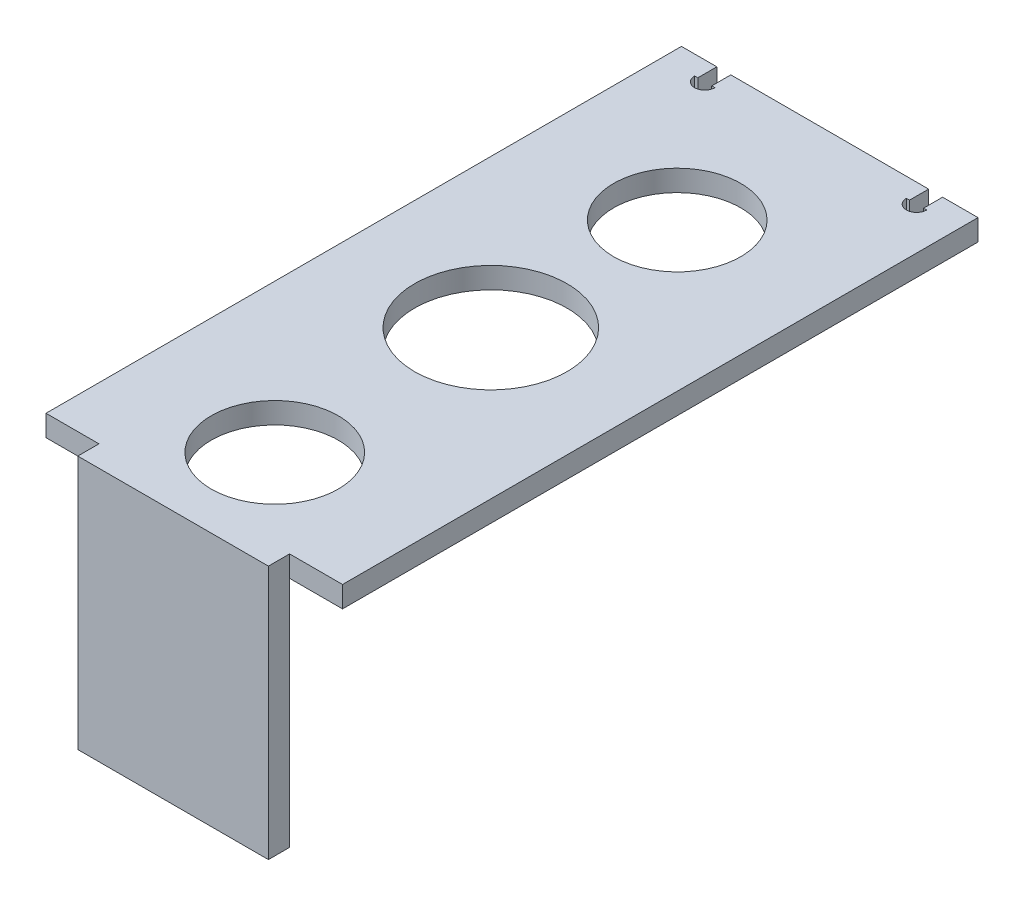
ISO-10303-21;
HEADER;
FILE_DESCRIPTION(('STEP AP214'),'2;1');
FILE_NAME('part.step','',(''),(''),'','','');
FILE_SCHEMA(('AUTOMOTIVE_DESIGN { 1 0 10303 214 1 1 1 1 }'));
ENDSEC;
DATA;
#1=APPLICATION_CONTEXT('core data for automotive mechanical design processes');
#2=APPLICATION_PROTOCOL_DEFINITION('international standard','automotive_design',2000,#1);
#3=PRODUCT_CONTEXT('',#1,'mechanical');
#4=PRODUCT('Part','Part','',(#3));
#5=PRODUCT_RELATED_PRODUCT_CATEGORY('part','',(#4));
#6=PRODUCT_DEFINITION_FORMATION('','',#4);
#7=PRODUCT_DEFINITION_CONTEXT('part definition',#1,'design');
#8=PRODUCT_DEFINITION('design','',#6,#7);
#9=PRODUCT_DEFINITION_SHAPE('','',#8);
#10=(LENGTH_UNIT() NAMED_UNIT(*) SI_UNIT(.MILLI.,.METRE.));
#11=(NAMED_UNIT(*) PLANE_ANGLE_UNIT() SI_UNIT($,.RADIAN.));
#12=(NAMED_UNIT(*) SI_UNIT($,.STERADIAN.) SOLID_ANGLE_UNIT());
#13=UNCERTAINTY_MEASURE_WITH_UNIT(LENGTH_MEASURE(1.E-05),#10,'distance_accuracy_value','');
#14=(GEOMETRIC_REPRESENTATION_CONTEXT(3) GLOBAL_UNCERTAINTY_ASSIGNED_CONTEXT((#13)) GLOBAL_UNIT_ASSIGNED_CONTEXT((#10,
#11,#12)) REPRESENTATION_CONTEXT('',''));
#15=CARTESIAN_POINT('',(0.,0.,0.));
#16=DIRECTION('',(0.,0.,1.));
#17=DIRECTION('',(1.,0.,0.));
#18=AXIS2_PLACEMENT_3D('',#15,#16,#17);
#19=CARTESIAN_POINT('',(0.,2.5,70.));
#20=DIRECTION('',(0.,0.,-1.));
#21=DIRECTION('',(-1.,0.,0.));
#22=AXIS2_PLACEMENT_3D('',#19,#20,#21);
#23=PLANE('',#22);
#24=DIRECTION('',(0.,1.,0.));
#25=VECTOR('',#24,1.);
#26=CARTESIAN_POINT('',(22.5,2.5,70.));
#27=LINE('',#26,#25);
#28=CARTESIAN_POINT('',(22.5,-2.5,70.));
#29=VERTEX_POINT('',#28);
#30=CARTESIAN_POINT('',(22.5,2.5,70.));
#31=VERTEX_POINT('',#30);
#32=EDGE_CURVE('E57',#29,#31,#27,.T.);
#33=ORIENTED_EDGE('',*,*,#32,.F.);
#34=DIRECTION('',(1.,0.,0.));
#35=VECTOR('',#34,1.);
#36=CARTESIAN_POINT('',(0.,-2.5,70.));
#37=LINE('',#36,#35);
#38=CARTESIAN_POINT('',(35.,-2.5,70.));
#39=VERTEX_POINT('',#38);
#40=EDGE_CURVE('E357',#29,#39,#37,.T.);
#41=ORIENTED_EDGE('',*,*,#40,.T.);
#42=DIRECTION('',(0.,1.,0.));
#43=VECTOR('',#42,1.);
#44=CARTESIAN_POINT('',(35.,-117.5,70.));
#45=LINE('',#44,#43);
#46=CARTESIAN_POINT('',(35.,2.5,70.));
#47=VERTEX_POINT('',#46);
#48=EDGE_CURVE('E193',#39,#47,#45,.T.);
#49=ORIENTED_EDGE('',*,*,#48,.T.);
#50=DIRECTION('',(1.,0.,0.));
#51=VECTOR('',#50,1.);
#52=CARTESIAN_POINT('',(0.,2.5,70.));
#53=LINE('',#52,#51);
#54=EDGE_CURVE('E191',#31,#47,#53,.T.);
#55=ORIENTED_EDGE('',*,*,#54,.F.);
#56=EDGE_LOOP('',(#33,#41,#49,#55));
#57=FACE_BOUND('',#56,.T.);
#58=ADVANCED_FACE('F47',(#57),#23,.F.);
#59=CARTESIAN_POINT('',(0.,2.5,-80.));
#60=DIRECTION('',(0.,0.,-1.));
#61=DIRECTION('',(-1.,0.,0.));
#62=AXIS2_PLACEMENT_3D('',#59,#60,#61);
#63=PLANE('',#62);
#64=DIRECTION('',(1.,0.,0.));
#65=VECTOR('',#64,1.);
#66=CARTESIAN_POINT('',(0.,-2.5,-80.));
#67=LINE('',#66,#65);
#68=CARTESIAN_POINT('',(-35.,-2.5,-80.));
#69=VERTEX_POINT('',#68);
#70=CARTESIAN_POINT('',(-26.65,-2.5,-80.));
#71=VERTEX_POINT('',#70);
#72=EDGE_CURVE('E332',#69,#71,#67,.T.);
#73=ORIENTED_EDGE('',*,*,#72,.F.);
#74=DIRECTION('',(0.,1.,0.));
#75=VECTOR('',#74,1.);
#76=CARTESIAN_POINT('',(-35.,-117.5,-80.));
#77=LINE('',#76,#75);
#78=CARTESIAN_POINT('',(-35.,2.5,-80.));
#79=VERTEX_POINT('',#78);
#80=EDGE_CURVE('E255',#69,#79,#77,.T.);
#81=ORIENTED_EDGE('',*,*,#80,.T.);
#82=DIRECTION('',(1.,0.,0.));
#83=VECTOR('',#82,1.);
#84=CARTESIAN_POINT('',(0.,2.5,-80.));
#85=LINE('',#84,#83);
#86=CARTESIAN_POINT('',(-26.65,2.5,-80.));
#87=VERTEX_POINT('',#86);
#88=EDGE_CURVE('E200',#79,#87,#85,.T.);
#89=ORIENTED_EDGE('',*,*,#88,.T.);
#90=DIRECTION('',(0.,-1.,0.));
#91=VECTOR('',#90,1.);
#92=CARTESIAN_POINT('',(-26.65,2.5,-80.));
#93=LINE('',#92,#91);
#94=EDGE_CURVE('E366',#87,#71,#93,.T.);
#95=ORIENTED_EDGE('',*,*,#94,.T.);
#96=EDGE_LOOP('',(#73,#81,#89,#95));
#97=FACE_BOUND('',#96,.T.);
#98=ADVANCED_FACE('F444',(#97),#63,.T.);
#99=CARTESIAN_POINT('',(-35.,-2.5,70.));
#100=VERTEX_POINT('',#99);
#101=CARTESIAN_POINT('',(-22.5,-2.5,70.));
#102=VERTEX_POINT('',#101);
#103=EDGE_CURVE('E353',#100,#102,#37,.T.);
#104=ORIENTED_EDGE('',*,*,#103,.T.);
#105=DIRECTION('',(0.,1.,0.));
#106=VECTOR('',#105,1.);
#107=CARTESIAN_POINT('',(-22.5,2.5,70.));
#108=LINE('',#107,#106);
#109=CARTESIAN_POINT('',(-22.5,2.5,70.));
#110=VERTEX_POINT('',#109);
#111=EDGE_CURVE('E11',#102,#110,#108,.T.);
#112=ORIENTED_EDGE('',*,*,#111,.T.);
#113=CARTESIAN_POINT('',(-35.,2.5,70.));
#114=VERTEX_POINT('',#113);
#115=EDGE_CURVE('E199',#114,#110,#53,.T.);
#116=ORIENTED_EDGE('',*,*,#115,.F.);
#117=DIRECTION('',(0.,1.,0.));
#118=VECTOR('',#117,1.);
#119=CARTESIAN_POINT('',(-35.,-117.5,70.));
#120=LINE('',#119,#118);
#121=EDGE_CURVE('E257',#100,#114,#120,.T.);
#122=ORIENTED_EDGE('',*,*,#121,.F.);
#123=EDGE_LOOP('',(#104,#112,#116,#122));
#124=FACE_BOUND('',#123,.T.);
#125=ADVANCED_FACE('F446',(#124),#23,.F.);
#126=CARTESIAN_POINT('',(26.65,2.5,-80.));
#127=VERTEX_POINT('',#126);
#128=CARTESIAN_POINT('',(35.,2.5,-80.));
#129=VERTEX_POINT('',#128);
#130=EDGE_CURVE('E289',#127,#129,#85,.T.);
#131=ORIENTED_EDGE('',*,*,#130,.T.);
#132=DIRECTION('',(0.,1.,0.));
#133=VECTOR('',#132,1.);
#134=CARTESIAN_POINT('',(35.,-117.5,-80.));
#135=LINE('',#134,#133);
#136=CARTESIAN_POINT('',(35.,-2.5,-80.));
#137=VERTEX_POINT('',#136);
#138=EDGE_CURVE('E256',#137,#129,#135,.T.);
#139=ORIENTED_EDGE('',*,*,#138,.F.);
#140=CARTESIAN_POINT('',(26.65,-2.5,-80.));
#141=VERTEX_POINT('',#140);
#142=EDGE_CURVE('E333',#141,#137,#67,.T.);
#143=ORIENTED_EDGE('',*,*,#142,.F.);
#144=DIRECTION('',(0.,-1.,0.));
#145=VECTOR('',#144,1.);
#146=CARTESIAN_POINT('',(26.65,2.5,-80.));
#147=LINE('',#146,#145);
#148=EDGE_CURVE('E363',#127,#141,#147,.T.);
#149=ORIENTED_EDGE('',*,*,#148,.F.);
#150=EDGE_LOOP('',(#131,#139,#143,#149));
#151=FACE_BOUND('',#150,.T.);
#152=ADVANCED_FACE('F454',(#151),#63,.T.);
#153=CARTESIAN_POINT('',(0.,2.5,0.));
#154=DIRECTION('',(0.,1.,0.));
#155=DIRECTION('',(0.,0.,1.));
#156=AXIS2_PLACEMENT_3D('',#153,#154,#155);
#157=PLANE('',#156);
#158=CARTESIAN_POINT('',(0.,2.5,-44.));
#159=DIRECTION('',(0.,1.,0.));
#160=DIRECTION('',(0.,0.,1.));
#161=AXIS2_PLACEMENT_3D('',#158,#159,#160);
#162=CIRCLE('',#161,15.);
#163=CARTESIAN_POINT('',(0.,2.5,-29.));
#164=VERTEX_POINT('',#163);
#165=EDGE_CURVE('E233',#164,#164,#162,.T.);
#166=ORIENTED_EDGE('',*,*,#165,.F.);
#167=EDGE_LOOP('',(#166));
#168=FACE_BOUND('',#167,.T.);
#169=CARTESIAN_POINT('',(0.,2.5,0.));
#170=DIRECTION('',(0.,1.,0.));
#171=DIRECTION('',(0.,0.,1.));
#172=AXIS2_PLACEMENT_3D('',#169,#170,#171);
#173=CIRCLE('',#172,18.);
#174=CARTESIAN_POINT('',(0.,2.5,18.));
#175=VERTEX_POINT('',#174);
#176=EDGE_CURVE('E412',#175,#175,#173,.T.);
#177=ORIENTED_EDGE('',*,*,#176,.F.);
#178=EDGE_LOOP('',(#177));
#179=FACE_BOUND('',#178,.T.);
#180=CARTESIAN_POINT('',(0.,2.5,51.));
#181=DIRECTION('',(0.,1.,0.));
#182=DIRECTION('',(0.,0.,1.));
#183=AXIS2_PLACEMENT_3D('',#180,#181,#182);
#184=CIRCLE('',#183,15.);
#185=CARTESIAN_POINT('',(0.,2.5,66.));
#186=VERTEX_POINT('',#185);
#187=EDGE_CURVE('E408',#186,#186,#184,.T.);
#188=ORIENTED_EDGE('',*,*,#187,.F.);
#189=EDGE_LOOP('',(#188));
#190=FACE_BOUND('',#189,.T.);
#191=ORIENTED_EDGE('',*,*,#88,.F.);
#192=DIRECTION('',(0.,0.,1.));
#193=VECTOR('',#192,1.);
#194=CARTESIAN_POINT('',(-35.,2.5,0.));
#195=LINE('',#194,#193);
#196=EDGE_CURVE('E251',#79,#114,#195,.T.);
#197=ORIENTED_EDGE('',*,*,#196,.T.);
#198=ORIENTED_EDGE('',*,*,#115,.T.);
#199=DIRECTION('',(0.,0.,1.));
#200=VECTOR('',#199,1.);
#201=CARTESIAN_POINT('',(-22.5,2.5,70.));
#202=LINE('',#201,#200);
#203=CARTESIAN_POINT('',(-22.5,2.5,75.));
#204=VERTEX_POINT('',#203);
#205=EDGE_CURVE('E232',#110,#204,#202,.T.);
#206=ORIENTED_EDGE('',*,*,#205,.T.);
#207=DIRECTION('',(-1.,0.,0.));
#208=VECTOR('',#207,1.);
#209=CARTESIAN_POINT('',(22.5,2.5,75.));
#210=LINE('',#209,#208);
#211=CARTESIAN_POINT('',(22.5,2.5,75.));
#212=VERTEX_POINT('',#211);
#213=EDGE_CURVE('E215',#212,#204,#210,.T.);
#214=ORIENTED_EDGE('',*,*,#213,.F.);
#215=DIRECTION('',(0.,0.,1.));
#216=VECTOR('',#215,1.);
#217=CARTESIAN_POINT('',(22.5,2.5,70.));
#218=LINE('',#217,#216);
#219=EDGE_CURVE('E205',#31,#212,#218,.T.);
#220=ORIENTED_EDGE('',*,*,#219,.F.);
#221=ORIENTED_EDGE('',*,*,#54,.T.);
#222=DIRECTION('',(0.,0.,-1.));
#223=VECTOR('',#222,1.);
#224=CARTESIAN_POINT('',(35.,2.5,0.));
#225=LINE('',#224,#223);
#226=EDGE_CURVE('E250',#47,#129,#225,.T.);
#227=ORIENTED_EDGE('',*,*,#226,.T.);
#228=ORIENTED_EDGE('',*,*,#130,.F.);
#229=DIRECTION('',(0.,0.,1.));
#230=VECTOR('',#229,1.);
#231=CARTESIAN_POINT('',(26.6500000000001,2.5,0.));
#232=LINE('',#231,#230);
#233=CARTESIAN_POINT('',(26.65,2.5,-75.5));
#234=VERTEX_POINT('',#233);
#235=EDGE_CURVE('E310',#127,#234,#232,.T.);
#236=ORIENTED_EDGE('',*,*,#235,.T.);
#237=DIRECTION('',(1.,0.,0.));
#238=VECTOR('',#237,1.);
#239=CARTESIAN_POINT('',(0.,2.5,-75.5));
#240=LINE('',#239,#238);
#241=CARTESIAN_POINT('',(27.4,2.5,-75.5));
#242=VERTEX_POINT('',#241);
#243=EDGE_CURVE('E270',#234,#242,#240,.T.);
#244=ORIENTED_EDGE('',*,*,#243,.T.);
#245=CARTESIAN_POINT('',(25.,2.5,-75.5));
#246=DIRECTION('',(0.,1.,0.));
#247=DIRECTION('',(0.,0.,1.));
#248=AXIS2_PLACEMENT_3D('',#245,#246,#247);
#249=CIRCLE('',#248,2.4);
#250=CARTESIAN_POINT('',(22.6,2.5,-75.5));
#251=VERTEX_POINT('',#250);
#252=EDGE_CURVE('E274',#242,#251,#249,.F.);
#253=ORIENTED_EDGE('',*,*,#252,.T.);
#254=DIRECTION('',(1.,0.,0.));
#255=VECTOR('',#254,1.);
#256=CARTESIAN_POINT('',(0.,2.5,-75.5));
#257=LINE('',#256,#255);
#258=CARTESIAN_POINT('',(23.35,2.5,-75.5));
#259=VERTEX_POINT('',#258);
#260=EDGE_CURVE('E278',#251,#259,#257,.T.);
#261=ORIENTED_EDGE('',*,*,#260,.T.);
#262=DIRECTION('',(0.,0.,-1.));
#263=VECTOR('',#262,1.);
#264=CARTESIAN_POINT('',(23.35,2.5,0.));
#265=LINE('',#264,#263);
#266=CARTESIAN_POINT('',(23.35,2.5,-80.));
#267=VERTEX_POINT('',#266);
#268=EDGE_CURVE('E281',#259,#267,#265,.T.);
#269=ORIENTED_EDGE('',*,*,#268,.T.);
#270=CARTESIAN_POINT('',(-23.35,2.5,-80.));
#271=VERTEX_POINT('',#270);
#272=EDGE_CURVE('E284',#271,#267,#85,.T.);
#273=ORIENTED_EDGE('',*,*,#272,.F.);
#274=DIRECTION('',(0.,0.,-1.));
#275=VECTOR('',#274,1.);
#276=CARTESIAN_POINT('',(-23.35,2.5,0.));
#277=LINE('',#276,#275);
#278=CARTESIAN_POINT('',(-23.35,2.5,-75.5));
#279=VERTEX_POINT('',#278);
#280=EDGE_CURVE('E288',#279,#271,#277,.T.);
#281=ORIENTED_EDGE('',*,*,#280,.F.);
#282=DIRECTION('',(-1.,0.,0.));
#283=VECTOR('',#282,1.);
#284=CARTESIAN_POINT('',(0.,2.5,-75.5));
#285=LINE('',#284,#283);
#286=CARTESIAN_POINT('',(-22.6,2.5,-75.5));
#287=VERTEX_POINT('',#286);
#288=EDGE_CURVE('E293',#287,#279,#285,.T.);
#289=ORIENTED_EDGE('',*,*,#288,.F.);
#290=CARTESIAN_POINT('',(-25.,2.5,-75.5));
#291=DIRECTION('',(0.,1.,0.));
#292=DIRECTION('',(0.,0.,1.));
#293=AXIS2_PLACEMENT_3D('',#290,#291,#292);
#294=CIRCLE('',#293,2.4);
#295=CARTESIAN_POINT('',(-27.4,2.5,-75.5));
#296=VERTEX_POINT('',#295);
#297=EDGE_CURVE('E297',#296,#287,#294,.T.);
#298=ORIENTED_EDGE('',*,*,#297,.F.);
#299=DIRECTION('',(-1.,0.,0.));
#300=VECTOR('',#299,1.);
#301=CARTESIAN_POINT('',(0.,2.5,-75.5));
#302=LINE('',#301,#300);
#303=CARTESIAN_POINT('',(-26.65,2.5,-75.5));
#304=VERTEX_POINT('',#303);
#305=EDGE_CURVE('E301',#304,#296,#302,.T.);
#306=ORIENTED_EDGE('',*,*,#305,.F.);
#307=DIRECTION('',(0.,0.,1.));
#308=VECTOR('',#307,1.);
#309=CARTESIAN_POINT('',(-26.6500000000001,2.5,0.));
#310=LINE('',#309,#308);
#311=EDGE_CURVE('E305',#87,#304,#310,.T.);
#312=ORIENTED_EDGE('',*,*,#311,.F.);
#313=EDGE_LOOP('',(#191,#197,#198,#206,#214,#220,#221,#227,#228,#236,#244,#253,#261,#269,#273,
#281,#289,#298,#306,#312));
#314=FACE_BOUND('',#313,.T.);
#315=ADVANCED_FACE('F213',(#168,#179,#190,#314),#157,.T.);
#316=CARTESIAN_POINT('',(0.,-2.5,0.));
#317=DIRECTION('',(0.,1.,0.));
#318=DIRECTION('',(0.,0.,1.));
#319=AXIS2_PLACEMENT_3D('',#316,#317,#318);
#320=PLANE('',#319);
#321=CARTESIAN_POINT('',(0.,-2.5,-44.));
#322=DIRECTION('',(0.,1.,0.));
#323=DIRECTION('',(0.,0.,1.));
#324=AXIS2_PLACEMENT_3D('',#321,#322,#323);
#325=CIRCLE('',#324,15.);
#326=CARTESIAN_POINT('',(0.,-2.5,-29.));
#327=VERTEX_POINT('',#326);
#328=EDGE_CURVE('E51',#327,#327,#325,.T.);
#329=ORIENTED_EDGE('',*,*,#328,.T.);
#330=EDGE_LOOP('',(#329));
#331=FACE_BOUND('',#330,.T.);
#332=CARTESIAN_POINT('',(0.,-2.5,0.));
#333=DIRECTION('',(0.,1.,0.));
#334=DIRECTION('',(0.,0.,1.));
#335=AXIS2_PLACEMENT_3D('',#332,#333,#334);
#336=CIRCLE('',#335,18.);
#337=CARTESIAN_POINT('',(0.,-2.5,18.));
#338=VERTEX_POINT('',#337);
#339=EDGE_CURVE('E409',#338,#338,#336,.T.);
#340=ORIENTED_EDGE('',*,*,#339,.T.);
#341=EDGE_LOOP('',(#340));
#342=FACE_BOUND('',#341,.T.);
#343=CARTESIAN_POINT('',(0.,-2.5,51.));
#344=DIRECTION('',(0.,1.,0.));
#345=DIRECTION('',(0.,0.,1.));
#346=AXIS2_PLACEMENT_3D('',#343,#344,#345);
#347=CIRCLE('',#346,15.);
#348=CARTESIAN_POINT('',(0.,-2.5,66.));
#349=VERTEX_POINT('',#348);
#350=EDGE_CURVE('E405',#349,#349,#347,.T.);
#351=ORIENTED_EDGE('',*,*,#350,.T.);
#352=EDGE_LOOP('',(#351));
#353=FACE_BOUND('',#352,.T.);
#354=DIRECTION('',(0.,0.,1.));
#355=VECTOR('',#354,1.);
#356=CARTESIAN_POINT('',(-35.,-2.5,0.));
#357=LINE('',#356,#355);
#358=EDGE_CURVE('E210',#69,#100,#357,.T.);
#359=ORIENTED_EDGE('',*,*,#358,.F.);
#360=ORIENTED_EDGE('',*,*,#72,.T.);
#361=DIRECTION('',(0.,0.,1.));
#362=VECTOR('',#361,1.);
#363=CARTESIAN_POINT('',(-26.6500000000001,-2.5,0.));
#364=LINE('',#363,#362);
#365=CARTESIAN_POINT('',(-26.65,-2.5,-75.5));
#366=VERTEX_POINT('',#365);
#367=EDGE_CURVE('E349',#71,#366,#364,.T.);
#368=ORIENTED_EDGE('',*,*,#367,.T.);
#369=DIRECTION('',(-1.,0.,0.));
#370=VECTOR('',#369,1.);
#371=CARTESIAN_POINT('',(0.,-2.5,-75.5));
#372=LINE('',#371,#370);
#373=CARTESIAN_POINT('',(-27.4,-2.5,-75.5));
#374=VERTEX_POINT('',#373);
#375=EDGE_CURVE('E345',#366,#374,#372,.T.);
#376=ORIENTED_EDGE('',*,*,#375,.T.);
#377=CARTESIAN_POINT('',(-25.,-2.5,-75.5));
#378=DIRECTION('',(0.,1.,0.));
#379=DIRECTION('',(0.,0.,1.));
#380=AXIS2_PLACEMENT_3D('',#377,#378,#379);
#381=CIRCLE('',#380,2.4);
#382=CARTESIAN_POINT('',(-22.6,-2.5,-75.5));
#383=VERTEX_POINT('',#382);
#384=EDGE_CURVE('E341',#374,#383,#381,.T.);
#385=ORIENTED_EDGE('',*,*,#384,.T.);
#386=DIRECTION('',(-1.,0.,0.));
#387=VECTOR('',#386,1.);
#388=CARTESIAN_POINT('',(0.,-2.5,-75.5));
#389=LINE('',#388,#387);
#390=CARTESIAN_POINT('',(-23.35,-2.5,-75.5));
#391=VERTEX_POINT('',#390);
#392=EDGE_CURVE('E337',#383,#391,#389,.T.);
#393=ORIENTED_EDGE('',*,*,#392,.T.);
#394=DIRECTION('',(0.,0.,-1.));
#395=VECTOR('',#394,1.);
#396=CARTESIAN_POINT('',(-23.35,-2.5,0.));
#397=LINE('',#396,#395);
#398=CARTESIAN_POINT('',(-23.35,-2.5,-80.));
#399=VERTEX_POINT('',#398);
#400=EDGE_CURVE('E331',#391,#399,#397,.T.);
#401=ORIENTED_EDGE('',*,*,#400,.T.);
#402=CARTESIAN_POINT('',(23.35,-2.5,-80.));
#403=VERTEX_POINT('',#402);
#404=EDGE_CURVE('E327',#399,#403,#67,.T.);
#405=ORIENTED_EDGE('',*,*,#404,.T.);
#406=DIRECTION('',(0.,0.,-1.));
#407=VECTOR('',#406,1.);
#408=CARTESIAN_POINT('',(23.35,-2.5,0.));
#409=LINE('',#408,#407);
#410=CARTESIAN_POINT('',(23.35,-2.5,-75.5));
#411=VERTEX_POINT('',#410);
#412=EDGE_CURVE('E323',#411,#403,#409,.T.);
#413=ORIENTED_EDGE('',*,*,#412,.F.);
#414=DIRECTION('',(1.,0.,0.));
#415=VECTOR('',#414,1.);
#416=CARTESIAN_POINT('',(0.,-2.5,-75.5));
#417=LINE('',#416,#415);
#418=CARTESIAN_POINT('',(22.6,-2.5,-75.5));
#419=VERTEX_POINT('',#418);
#420=EDGE_CURVE('E320',#419,#411,#417,.T.);
#421=ORIENTED_EDGE('',*,*,#420,.F.);
#422=CARTESIAN_POINT('',(25.,-2.5,-75.5));
#423=DIRECTION('',(0.,1.,0.));
#424=DIRECTION('',(0.,0.,1.));
#425=AXIS2_PLACEMENT_3D('',#422,#423,#424);
#426=CIRCLE('',#425,2.4);
#427=CARTESIAN_POINT('',(27.4,-2.5,-75.5));
#428=VERTEX_POINT('',#427);
#429=EDGE_CURVE('E317',#428,#419,#426,.F.);
#430=ORIENTED_EDGE('',*,*,#429,.F.);
#431=DIRECTION('',(1.,0.,0.));
#432=VECTOR('',#431,1.);
#433=CARTESIAN_POINT('',(0.,-2.5,-75.5));
#434=LINE('',#433,#432);
#435=CARTESIAN_POINT('',(26.65,-2.5,-75.5));
#436=VERTEX_POINT('',#435);
#437=EDGE_CURVE('E260',#436,#428,#434,.T.);
#438=ORIENTED_EDGE('',*,*,#437,.F.);
#439=DIRECTION('',(0.,0.,1.));
#440=VECTOR('',#439,1.);
#441=CARTESIAN_POINT('',(26.6500000000001,-2.5,0.));
#442=LINE('',#441,#440);
#443=EDGE_CURVE('E275',#141,#436,#442,.T.);
#444=ORIENTED_EDGE('',*,*,#443,.F.);
#445=ORIENTED_EDGE('',*,*,#142,.T.);
#446=DIRECTION('',(0.,0.,-1.));
#447=VECTOR('',#446,1.);
#448=CARTESIAN_POINT('',(35.,-2.5,0.));
#449=LINE('',#448,#447);
#450=EDGE_CURVE('E400',#39,#137,#449,.T.);
#451=ORIENTED_EDGE('',*,*,#450,.F.);
#452=ORIENTED_EDGE('',*,*,#40,.F.);
#453=EDGE_CURVE('E356',#102,#29,#37,.T.);
#454=ORIENTED_EDGE('',*,*,#453,.F.);
#455=ORIENTED_EDGE('',*,*,#103,.F.);
#456=EDGE_LOOP('',(#359,#360,#368,#376,#385,#393,#401,#405,#413,#421,#430,#438,#444,#445,#451,
#452,#454,#455));
#457=FACE_BOUND('',#456,.T.);
#458=ADVANCED_FACE('F431',(#331,#342,#353,#457),#320,.F.);
#459=CARTESIAN_POINT('',(0.,2.5,-75.5));
#460=DIRECTION('',(0.,0.,-1.));
#461=DIRECTION('',(-1.,0.,0.));
#462=AXIS2_PLACEMENT_3D('',#459,#460,#461);
#463=PLANE('',#462);
#464=ORIENTED_EDGE('',*,*,#437,.T.);
#465=DIRECTION('',(0.,-1.,0.));
#466=VECTOR('',#465,1.);
#467=CARTESIAN_POINT('',(27.4,2.5,-75.5));
#468=LINE('',#467,#466);
#469=EDGE_CURVE('E396',#242,#428,#468,.T.);
#470=ORIENTED_EDGE('',*,*,#469,.F.);
#471=ORIENTED_EDGE('',*,*,#243,.F.);
#472=DIRECTION('',(0.,-1.,0.));
#473=VECTOR('',#472,1.);
#474=CARTESIAN_POINT('',(26.65,2.5,-75.5));
#475=LINE('',#474,#473);
#476=EDGE_CURVE('E313',#234,#436,#475,.T.);
#477=ORIENTED_EDGE('',*,*,#476,.T.);
#478=EDGE_LOOP('',(#464,#470,#471,#477));
#479=FACE_BOUND('',#478,.T.);
#480=ADVANCED_FACE('F49',(#479),#463,.F.);
#481=CARTESIAN_POINT('',(25.,2.5,-75.5));
#482=DIRECTION('',(0.,-1.,0.));
#483=DIRECTION('',(0.,0.,-1.));
#484=AXIS2_PLACEMENT_3D('',#481,#482,#483);
#485=CYLINDRICAL_SURFACE('',#484,2.4);
#486=ORIENTED_EDGE('',*,*,#429,.T.);
#487=DIRECTION('',(0.,-1.,0.));
#488=VECTOR('',#487,1.);
#489=CARTESIAN_POINT('',(22.6,2.5,-75.5));
#490=LINE('',#489,#488);
#491=EDGE_CURVE('E392',#251,#419,#490,.T.);
#492=ORIENTED_EDGE('',*,*,#491,.F.);
#493=ORIENTED_EDGE('',*,*,#252,.F.);
#494=ORIENTED_EDGE('',*,*,#469,.T.);
#495=EDGE_LOOP('',(#486,#492,#493,#494));
#496=FACE_BOUND('',#495,.T.);
#497=ADVANCED_FACE('F525',(#496),#485,.F.);
#498=CARTESIAN_POINT('',(0.,2.5,-75.5));
#499=DIRECTION('',(0.,0.,-1.));
#500=DIRECTION('',(-1.,0.,0.));
#501=AXIS2_PLACEMENT_3D('',#498,#499,#500);
#502=PLANE('',#501);
#503=ORIENTED_EDGE('',*,*,#420,.T.);
#504=DIRECTION('',(0.,-1.,0.));
#505=VECTOR('',#504,1.);
#506=CARTESIAN_POINT('',(23.35,2.5,-75.5));
#507=LINE('',#506,#505);
#508=EDGE_CURVE('E388',#259,#411,#507,.T.);
#509=ORIENTED_EDGE('',*,*,#508,.F.);
#510=ORIENTED_EDGE('',*,*,#260,.F.);
#511=ORIENTED_EDGE('',*,*,#491,.T.);
#512=EDGE_LOOP('',(#503,#509,#510,#511));
#513=FACE_BOUND('',#512,.T.);
#514=ADVANCED_FACE('F565',(#513),#502,.F.);
#515=CARTESIAN_POINT('',(23.35,2.5,0.));
#516=DIRECTION('',(-1.,0.,0.));
#517=DIRECTION('',(0.,0.,1.));
#518=AXIS2_PLACEMENT_3D('',#515,#516,#517);
#519=PLANE('',#518);
#520=ORIENTED_EDGE('',*,*,#412,.T.);
#521=DIRECTION('',(0.,-1.,0.));
#522=VECTOR('',#521,1.);
#523=CARTESIAN_POINT('',(23.35,2.5,-80.));
#524=LINE('',#523,#522);
#525=EDGE_CURVE('E385',#267,#403,#524,.T.);
#526=ORIENTED_EDGE('',*,*,#525,.F.);
#527=ORIENTED_EDGE('',*,*,#268,.F.);
#528=ORIENTED_EDGE('',*,*,#508,.T.);
#529=EDGE_LOOP('',(#520,#526,#527,#528));
#530=FACE_BOUND('',#529,.T.);
#531=ADVANCED_FACE('F562',(#530),#519,.F.);
#532=ORIENTED_EDGE('',*,*,#404,.F.);
#533=DIRECTION('',(0.,-1.,0.));
#534=VECTOR('',#533,1.);
#535=CARTESIAN_POINT('',(-23.35,2.5,-80.));
#536=LINE('',#535,#534);
#537=EDGE_CURVE('E382',#271,#399,#536,.T.);
#538=ORIENTED_EDGE('',*,*,#537,.F.);
#539=ORIENTED_EDGE('',*,*,#272,.T.);
#540=ORIENTED_EDGE('',*,*,#525,.T.);
#541=EDGE_LOOP('',(#532,#538,#539,#540));
#542=FACE_BOUND('',#541,.T.);
#543=ADVANCED_FACE('F455',(#542),#63,.T.);
#544=CARTESIAN_POINT('',(-23.35,2.5,0.));
#545=DIRECTION('',(-1.,0.,0.));
#546=DIRECTION('',(0.,0.,1.));
#547=AXIS2_PLACEMENT_3D('',#544,#545,#546);
#548=PLANE('',#547);
#549=ORIENTED_EDGE('',*,*,#400,.F.);
#550=DIRECTION('',(0.,-1.,0.));
#551=VECTOR('',#550,1.);
#552=CARTESIAN_POINT('',(-23.35,2.5,-75.5));
#553=LINE('',#552,#551);
#554=EDGE_CURVE('E379',#279,#391,#553,.T.);
#555=ORIENTED_EDGE('',*,*,#554,.F.);
#556=ORIENTED_EDGE('',*,*,#280,.T.);
#557=ORIENTED_EDGE('',*,*,#537,.T.);
#558=EDGE_LOOP('',(#549,#555,#556,#557));
#559=FACE_BOUND('',#558,.T.);
#560=ADVANCED_FACE('F555',(#559),#548,.T.);
#561=CARTESIAN_POINT('',(0.,2.5,-75.5));
#562=DIRECTION('',(0.,0.,1.));
#563=DIRECTION('',(1.,0.,0.));
#564=AXIS2_PLACEMENT_3D('',#561,#562,#563);
#565=PLANE('',#564);
#566=ORIENTED_EDGE('',*,*,#392,.F.);
#567=DIRECTION('',(0.,-1.,0.));
#568=VECTOR('',#567,1.);
#569=CARTESIAN_POINT('',(-22.6,2.5,-75.5));
#570=LINE('',#569,#568);
#571=EDGE_CURVE('E376',#287,#383,#570,.T.);
#572=ORIENTED_EDGE('',*,*,#571,.F.);
#573=ORIENTED_EDGE('',*,*,#288,.T.);
#574=ORIENTED_EDGE('',*,*,#554,.T.);
#575=EDGE_LOOP('',(#566,#572,#573,#574));
#576=FACE_BOUND('',#575,.T.);
#577=ADVANCED_FACE('F551',(#576),#565,.T.);
#578=CARTESIAN_POINT('',(-25.,2.5,-75.5));
#579=DIRECTION('',(0.,-1.,0.));
#580=DIRECTION('',(0.,0.,-1.));
#581=AXIS2_PLACEMENT_3D('',#578,#579,#580);
#582=CYLINDRICAL_SURFACE('',#581,2.4);
#583=ORIENTED_EDGE('',*,*,#384,.F.);
#584=DIRECTION('',(0.,-1.,0.));
#585=VECTOR('',#584,1.);
#586=CARTESIAN_POINT('',(-27.4,2.5,-75.5));
#587=LINE('',#586,#585);
#588=EDGE_CURVE('E373',#296,#374,#587,.T.);
#589=ORIENTED_EDGE('',*,*,#588,.F.);
#590=ORIENTED_EDGE('',*,*,#297,.T.);
#591=ORIENTED_EDGE('',*,*,#571,.T.);
#592=EDGE_LOOP('',(#583,#589,#590,#591));
#593=FACE_BOUND('',#592,.T.);
#594=ADVANCED_FACE('F549',(#593),#582,.F.);
#595=CARTESIAN_POINT('',(0.,2.5,-75.5));
#596=DIRECTION('',(0.,0.,1.));
#597=DIRECTION('',(1.,0.,0.));
#598=AXIS2_PLACEMENT_3D('',#595,#596,#597);
#599=PLANE('',#598);
#600=ORIENTED_EDGE('',*,*,#375,.F.);
#601=DIRECTION('',(0.,-1.,0.));
#602=VECTOR('',#601,1.);
#603=CARTESIAN_POINT('',(-26.65,2.5,-75.5));
#604=LINE('',#603,#602);
#605=EDGE_CURVE('E370',#304,#366,#604,.T.);
#606=ORIENTED_EDGE('',*,*,#605,.F.);
#607=ORIENTED_EDGE('',*,*,#305,.T.);
#608=ORIENTED_EDGE('',*,*,#588,.T.);
#609=EDGE_LOOP('',(#600,#606,#607,#608));
#610=FACE_BOUND('',#609,.T.);
#611=ADVANCED_FACE('F510',(#610),#599,.T.);
#612=CARTESIAN_POINT('',(-26.6500000000001,2.5,0.));
#613=DIRECTION('',(1.,0.,0.));
#614=DIRECTION('',(0.,0.,-1.));
#615=AXIS2_PLACEMENT_3D('',#612,#613,#614);
#616=PLANE('',#615);
#617=ORIENTED_EDGE('',*,*,#367,.F.);
#618=ORIENTED_EDGE('',*,*,#94,.F.);
#619=ORIENTED_EDGE('',*,*,#311,.T.);
#620=ORIENTED_EDGE('',*,*,#605,.T.);
#621=EDGE_LOOP('',(#617,#618,#619,#620));
#622=FACE_BOUND('',#621,.T.);
#623=ADVANCED_FACE('F505',(#622),#616,.T.);
#624=CARTESIAN_POINT('',(26.6500000000001,2.5,0.));
#625=DIRECTION('',(1.,0.,0.));
#626=DIRECTION('',(0.,0.,-1.));
#627=AXIS2_PLACEMENT_3D('',#624,#625,#626);
#628=PLANE('',#627);
#629=ORIENTED_EDGE('',*,*,#443,.T.);
#630=ORIENTED_EDGE('',*,*,#476,.F.);
#631=ORIENTED_EDGE('',*,*,#235,.F.);
#632=ORIENTED_EDGE('',*,*,#148,.T.);
#633=EDGE_LOOP('',(#629,#630,#631,#632));
#634=FACE_BOUND('',#633,.T.);
#635=ADVANCED_FACE('F497',(#634),#628,.F.);
#636=CARTESIAN_POINT('',(35.,-117.5,0.));
#637=DIRECTION('',(1.,0.,0.));
#638=DIRECTION('',(0.,0.,-1.));
#639=AXIS2_PLACEMENT_3D('',#636,#637,#638);
#640=PLANE('',#639);
#641=ORIENTED_EDGE('',*,*,#450,.T.);
#642=ORIENTED_EDGE('',*,*,#138,.T.);
#643=ORIENTED_EDGE('',*,*,#226,.F.);
#644=ORIENTED_EDGE('',*,*,#48,.F.);
#645=EDGE_LOOP('',(#641,#642,#643,#644));
#646=FACE_BOUND('',#645,.T.);
#647=ADVANCED_FACE('F493',(#646),#640,.T.);
#648=CARTESIAN_POINT('',(-35.,-117.5,0.));
#649=DIRECTION('',(-1.,0.,0.));
#650=DIRECTION('',(0.,0.,1.));
#651=AXIS2_PLACEMENT_3D('',#648,#649,#650);
#652=PLANE('',#651);
#653=ORIENTED_EDGE('',*,*,#358,.T.);
#654=ORIENTED_EDGE('',*,*,#121,.T.);
#655=ORIENTED_EDGE('',*,*,#196,.F.);
#656=ORIENTED_EDGE('',*,*,#80,.F.);
#657=EDGE_LOOP('',(#653,#654,#655,#656));
#658=FACE_BOUND('',#657,.T.);
#659=ADVANCED_FACE('F488',(#658),#652,.T.);
#660=CARTESIAN_POINT('',(22.5,2.5,70.));
#661=DIRECTION('',(0.,0.,1.));
#662=DIRECTION('',(0.,-1.,0.));
#663=AXIS2_PLACEMENT_3D('',#660,#661,#662);
#664=PLANE('',#663);
#665=CARTESIAN_POINT('',(-22.5,-57.5,70.));
#666=VERTEX_POINT('',#665);
#667=EDGE_CURVE('E59',#666,#102,#108,.T.);
#668=ORIENTED_EDGE('',*,*,#667,.T.);
#669=ORIENTED_EDGE('',*,*,#453,.T.);
#670=CARTESIAN_POINT('',(22.5,-57.5,70.));
#671=VERTEX_POINT('',#670);
#672=EDGE_CURVE('E208',#671,#29,#27,.T.);
#673=ORIENTED_EDGE('',*,*,#672,.F.);
#674=DIRECTION('',(-1.,0.,0.));
#675=VECTOR('',#674,1.);
#676=CARTESIAN_POINT('',(22.5,-57.5,70.));
#677=LINE('',#676,#675);
#678=EDGE_CURVE('E228',#671,#666,#677,.T.);
#679=ORIENTED_EDGE('',*,*,#678,.T.);
#680=EDGE_LOOP('',(#668,#669,#673,#679));
#681=FACE_BOUND('',#680,.T.);
#682=ADVANCED_FACE('F474',(#681),#664,.F.);
#683=CARTESIAN_POINT('',(22.5,2.5,75.));
#684=DIRECTION('',(0.,0.,-1.));
#685=DIRECTION('',(0.,1.,0.));
#686=AXIS2_PLACEMENT_3D('',#683,#684,#685);
#687=PLANE('',#686);
#688=DIRECTION('',(0.,-1.,0.));
#689=VECTOR('',#688,1.);
#690=CARTESIAN_POINT('',(-22.5,2.5,75.));
#691=LINE('',#690,#689);
#692=CARTESIAN_POINT('',(-22.5,-57.5,75.));
#693=VERTEX_POINT('',#692);
#694=EDGE_CURVE('E236',#204,#693,#691,.T.);
#695=ORIENTED_EDGE('',*,*,#694,.T.);
#696=DIRECTION('',(-1.,0.,0.));
#697=VECTOR('',#696,1.);
#698=CARTESIAN_POINT('',(22.5,-57.5,75.));
#699=LINE('',#698,#697);
#700=CARTESIAN_POINT('',(22.5,-57.5,75.));
#701=VERTEX_POINT('',#700);
#702=EDGE_CURVE('E244',#701,#693,#699,.T.);
#703=ORIENTED_EDGE('',*,*,#702,.F.);
#704=DIRECTION('',(0.,-1.,0.));
#705=VECTOR('',#704,1.);
#706=CARTESIAN_POINT('',(22.5,2.5,75.));
#707=LINE('',#706,#705);
#708=EDGE_CURVE('E218',#212,#701,#707,.T.);
#709=ORIENTED_EDGE('',*,*,#708,.F.);
#710=ORIENTED_EDGE('',*,*,#213,.T.);
#711=EDGE_LOOP('',(#695,#703,#709,#710));
#712=FACE_BOUND('',#711,.T.);
#713=ADVANCED_FACE('F481',(#712),#687,.F.);
#714=CARTESIAN_POINT('',(22.5,-57.5,70.));
#715=DIRECTION('',(0.,1.,0.));
#716=DIRECTION('',(0.,0.,1.));
#717=AXIS2_PLACEMENT_3D('',#714,#715,#716);
#718=PLANE('',#717);
#719=DIRECTION('',(0.,0.,-1.));
#720=VECTOR('',#719,1.);
#721=CARTESIAN_POINT('',(-22.5,-57.5,70.));
#722=LINE('',#721,#720);
#723=EDGE_CURVE('E224',#693,#666,#722,.T.);
#724=ORIENTED_EDGE('',*,*,#723,.T.);
#725=ORIENTED_EDGE('',*,*,#678,.F.);
#726=DIRECTION('',(0.,0.,-1.));
#727=VECTOR('',#726,1.);
#728=CARTESIAN_POINT('',(22.5,-57.5,70.));
#729=LINE('',#728,#727);
#730=EDGE_CURVE('E222',#701,#671,#729,.T.);
#731=ORIENTED_EDGE('',*,*,#730,.F.);
#732=ORIENTED_EDGE('',*,*,#702,.T.);
#733=EDGE_LOOP('',(#724,#725,#731,#732));
#734=FACE_BOUND('',#733,.T.);
#735=ADVANCED_FACE('F478',(#734),#718,.F.);
#736=CARTESIAN_POINT('',(22.5,0.,0.));
#737=DIRECTION('',(-1.,0.,0.));
#738=DIRECTION('',(0.,0.,1.));
#739=AXIS2_PLACEMENT_3D('',#736,#737,#738);
#740=PLANE('',#739);
#741=ORIENTED_EDGE('',*,*,#672,.T.);
#742=ORIENTED_EDGE('',*,*,#32,.T.);
#743=ORIENTED_EDGE('',*,*,#219,.T.);
#744=ORIENTED_EDGE('',*,*,#708,.T.);
#745=ORIENTED_EDGE('',*,*,#730,.T.);
#746=EDGE_LOOP('',(#741,#742,#743,#744,#745));
#747=FACE_BOUND('',#746,.T.);
#748=ADVANCED_FACE('F204',(#747),#740,.F.);
#749=CARTESIAN_POINT('',(-22.5,0.,0.));
#750=DIRECTION('',(-1.,0.,0.));
#751=DIRECTION('',(0.,0.,1.));
#752=AXIS2_PLACEMENT_3D('',#749,#750,#751);
#753=PLANE('',#752);
#754=ORIENTED_EDGE('',*,*,#667,.F.);
#755=ORIENTED_EDGE('',*,*,#723,.F.);
#756=ORIENTED_EDGE('',*,*,#694,.F.);
#757=ORIENTED_EDGE('',*,*,#205,.F.);
#758=ORIENTED_EDGE('',*,*,#111,.F.);
#759=EDGE_LOOP('',(#754,#755,#756,#757,#758));
#760=FACE_BOUND('',#759,.T.);
#761=ADVANCED_FACE('F469',(#760),#753,.T.);
#762=CARTESIAN_POINT('',(0.,-57.5,51.));
#763=DIRECTION('',(0.,1.,0.));
#764=DIRECTION('',(0.,0.,1.));
#765=AXIS2_PLACEMENT_3D('',#762,#763,#764);
#766=CYLINDRICAL_SURFACE('',#765,15.);
#767=ORIENTED_EDGE('',*,*,#187,.T.);
#768=EDGE_LOOP('',(#767));
#769=FACE_BOUND('',#768,.T.);
#770=ORIENTED_EDGE('',*,*,#350,.F.);
#771=EDGE_LOOP('',(#770));
#772=FACE_BOUND('',#771,.T.);
#773=ADVANCED_FACE('F440',(#769,#772),#766,.F.);
#774=CARTESIAN_POINT('',(0.,-57.5,0.));
#775=DIRECTION('',(0.,1.,0.));
#776=DIRECTION('',(0.,0.,1.));
#777=AXIS2_PLACEMENT_3D('',#774,#775,#776);
#778=CYLINDRICAL_SURFACE('',#777,18.);
#779=ORIENTED_EDGE('',*,*,#176,.T.);
#780=EDGE_LOOP('',(#779));
#781=FACE_BOUND('',#780,.T.);
#782=ORIENTED_EDGE('',*,*,#339,.F.);
#783=EDGE_LOOP('',(#782));
#784=FACE_BOUND('',#783,.T.);
#785=ADVANCED_FACE('F435',(#781,#784),#778,.F.);
#786=CARTESIAN_POINT('',(0.,-57.5,-44.));
#787=DIRECTION('',(0.,1.,0.));
#788=DIRECTION('',(0.,0.,1.));
#789=AXIS2_PLACEMENT_3D('',#786,#787,#788);
#790=CYLINDRICAL_SURFACE('',#789,15.);
#791=ORIENTED_EDGE('',*,*,#165,.T.);
#792=EDGE_LOOP('',(#791));
#793=FACE_BOUND('',#792,.T.);
#794=ORIENTED_EDGE('',*,*,#328,.F.);
#795=EDGE_LOOP('',(#794));
#796=FACE_BOUND('',#795,.T.);
#797=ADVANCED_FACE('F433',(#793,#796),#790,.F.);
#798=CLOSED_SHELL('',(#58,#98,#125,#152,#315,#458,#480,#497,#514,#531,#543,#560,#577,#594,#611,
#623,#635,#647,#659,#682,#713,#735,#748,#761,#773,#785,#797));
#799=MANIFOLD_SOLID_BREP('B2',#798);
#800=ADVANCED_BREP_SHAPE_REPRESENTATION('',(#18,#799),#14);
#801=SHAPE_DEFINITION_REPRESENTATION(#9,#800);
ENDSEC;
END-ISO-10303-21;
